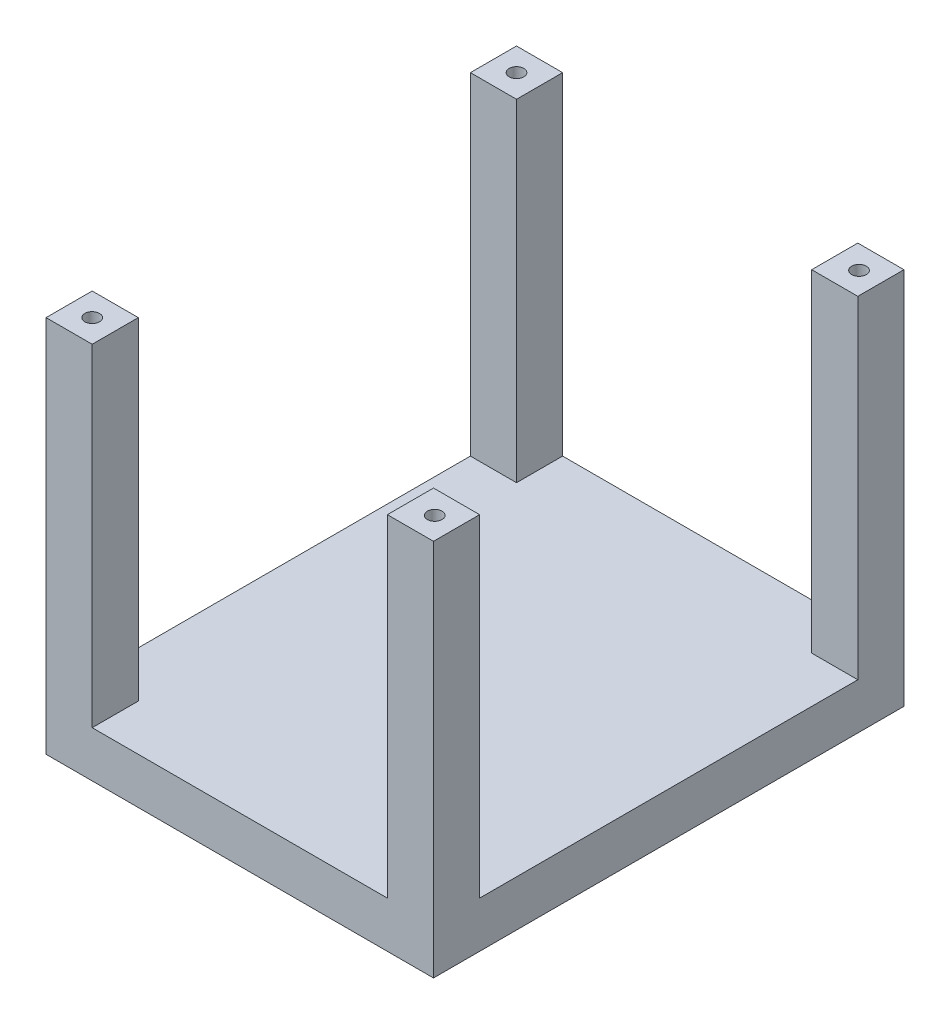
ISO-10303-21;
HEADER;
FILE_DESCRIPTION(('STEP AP214'),'2;1');
FILE_NAME('part.step','',(''),(''),'','','');
FILE_SCHEMA(('AUTOMOTIVE_DESIGN { 1 0 10303 214 1 1 1 1 }'));
ENDSEC;
DATA;
#1=APPLICATION_CONTEXT('core data for automotive mechanical design processes');
#2=APPLICATION_PROTOCOL_DEFINITION('international standard','automotive_design',2000,#1);
#3=PRODUCT_CONTEXT('',#1,'mechanical');
#4=PRODUCT('Part','Part','',(#3));
#5=PRODUCT_RELATED_PRODUCT_CATEGORY('part','',(#4));
#6=PRODUCT_DEFINITION_FORMATION('','',#4);
#7=PRODUCT_DEFINITION_CONTEXT('part definition',#1,'design');
#8=PRODUCT_DEFINITION('design','',#6,#7);
#9=PRODUCT_DEFINITION_SHAPE('','',#8);
#10=(LENGTH_UNIT() NAMED_UNIT(*) SI_UNIT(.MILLI.,.METRE.));
#11=(NAMED_UNIT(*) PLANE_ANGLE_UNIT() SI_UNIT($,.RADIAN.));
#12=(NAMED_UNIT(*) SI_UNIT($,.STERADIAN.) SOLID_ANGLE_UNIT());
#13=UNCERTAINTY_MEASURE_WITH_UNIT(LENGTH_MEASURE(1.E-05),#10,'distance_accuracy_value','');
#14=(GEOMETRIC_REPRESENTATION_CONTEXT(3) GLOBAL_UNCERTAINTY_ASSIGNED_CONTEXT((#13)) GLOBAL_UNIT_ASSIGNED_CONTEXT((#10,
#11,#12)) REPRESENTATION_CONTEXT('',''));
#15=CARTESIAN_POINT('',(0.,0.,0.));
#16=DIRECTION('',(0.,0.,1.));
#17=DIRECTION('',(1.,0.,0.));
#18=AXIS2_PLACEMENT_3D('',#15,#16,#17);
#19=CARTESIAN_POINT('',(0.,5.,0.));
#20=DIRECTION('',(0.,1.,0.));
#21=DIRECTION('',(0.,0.,1.));
#22=AXIS2_PLACEMENT_3D('',#19,#20,#21);
#23=PLANE('',#22);
#24=DIRECTION('',(1.,0.,0.));
#25=VECTOR('',#24,1.);
#26=CARTESIAN_POINT('',(-21.0659404071455,5.,39.3560433183073));
#27=LINE('',#26,#25);
#28=CARTESIAN_POINT('',(-16.0659404071455,5.,39.3560433183074));
#29=VERTEX_POINT('',#28);
#30=CARTESIAN_POINT('',(15.9340595928545,5.,39.3560433183073));
#31=VERTEX_POINT('',#30);
#32=EDGE_CURVE('E258',#29,#31,#27,.T.);
#33=ORIENTED_EDGE('',*,*,#32,.T.);
#34=DIRECTION('',(0.,0.,-1.));
#35=VECTOR('',#34,1.);
#36=CARTESIAN_POINT('',(15.9340595928545,5.,0.));
#37=LINE('',#36,#35);
#38=CARTESIAN_POINT('',(15.9340595928545,5.,34.3560433183073));
#39=VERTEX_POINT('',#38);
#40=EDGE_CURVE('E187',#31,#39,#37,.T.);
#41=ORIENTED_EDGE('',*,*,#40,.T.);
#42=DIRECTION('',(1.,0.,0.));
#43=VECTOR('',#42,1.);
#44=CARTESIAN_POINT('',(0.,5.,34.3560433183073));
#45=LINE('',#44,#43);
#46=CARTESIAN_POINT('',(20.9340595928545,5.,34.3560433183073));
#47=VERTEX_POINT('',#46);
#48=EDGE_CURVE('E174',#39,#47,#45,.T.);
#49=ORIENTED_EDGE('',*,*,#48,.T.);
#50=DIRECTION('',(0.,0.,-1.));
#51=VECTOR('',#50,1.);
#52=CARTESIAN_POINT('',(20.9340595928545,5.,-11.6439566816926));
#53=LINE('',#52,#51);
#54=CARTESIAN_POINT('',(20.9340595928545,5.,-6.64395668169275));
#55=VERTEX_POINT('',#54);
#56=EDGE_CURVE('E263',#47,#55,#53,.T.);
#57=ORIENTED_EDGE('',*,*,#56,.T.);
#58=DIRECTION('',(-1.,0.,0.));
#59=VECTOR('',#58,1.);
#60=CARTESIAN_POINT('',(0.,5.,-6.64395668169274));
#61=LINE('',#60,#59);
#62=CARTESIAN_POINT('',(15.9340595928545,5.,-6.64395668169274));
#63=VERTEX_POINT('',#62);
#64=EDGE_CURVE('E250',#55,#63,#61,.T.);
#65=ORIENTED_EDGE('',*,*,#64,.T.);
#66=DIRECTION('',(0.,0.,-1.));
#67=VECTOR('',#66,1.);
#68=CARTESIAN_POINT('',(15.9340595928545,5.,0.));
#69=LINE('',#68,#67);
#70=CARTESIAN_POINT('',(15.9340595928545,5.,-11.6439566816926));
#71=VERTEX_POINT('',#70);
#72=EDGE_CURVE('E11',#63,#71,#69,.T.);
#73=ORIENTED_EDGE('',*,*,#72,.T.);
#74=DIRECTION('',(-1.,0.,0.));
#75=VECTOR('',#74,1.);
#76=CARTESIAN_POINT('',(-21.0659404071455,5.,-11.6439566816926));
#77=LINE('',#76,#75);
#78=CARTESIAN_POINT('',(-16.0659404071455,5.,-11.6439566816926));
#79=VERTEX_POINT('',#78);
#80=EDGE_CURVE('E266',#71,#79,#77,.T.);
#81=ORIENTED_EDGE('',*,*,#80,.T.);
#82=DIRECTION('',(0.,0.,-1.));
#83=VECTOR('',#82,1.);
#84=CARTESIAN_POINT('',(-16.0659404071455,5.,-11.6439566816926));
#85=LINE('',#84,#83);
#86=CARTESIAN_POINT('',(-16.0659404071455,5.,-6.64395668169265));
#87=VERTEX_POINT('',#86);
#88=EDGE_CURVE('E285',#87,#79,#85,.T.);
#89=ORIENTED_EDGE('',*,*,#88,.F.);
#90=DIRECTION('',(1.,0.,0.));
#91=VECTOR('',#90,1.);
#92=CARTESIAN_POINT('',(-21.0659404071455,5.,-6.64395668169265));
#93=LINE('',#92,#91);
#94=CARTESIAN_POINT('',(-21.0659404071455,5.,-6.64395668169265));
#95=VERTEX_POINT('',#94);
#96=EDGE_CURVE('E289',#95,#87,#93,.T.);
#97=ORIENTED_EDGE('',*,*,#96,.F.);
#98=DIRECTION('',(0.,0.,1.));
#99=VECTOR('',#98,1.);
#100=CARTESIAN_POINT('',(-21.0659404071455,5.,-11.6439566816926));
#101=LINE('',#100,#99);
#102=CARTESIAN_POINT('',(-21.0659404071455,5.,34.3560433183074));
#103=VERTEX_POINT('',#102);
#104=EDGE_CURVE('E254',#95,#103,#101,.T.);
#105=ORIENTED_EDGE('',*,*,#104,.T.);
#106=DIRECTION('',(1.,0.,0.));
#107=VECTOR('',#106,1.);
#108=CARTESIAN_POINT('',(0.,5.,34.3560433183074));
#109=LINE('',#108,#107);
#110=CARTESIAN_POINT('',(-16.0659404071455,5.,34.3560433183074));
#111=VERTEX_POINT('',#110);
#112=EDGE_CURVE('E220',#103,#111,#109,.T.);
#113=ORIENTED_EDGE('',*,*,#112,.T.);
#114=DIRECTION('',(0.,0.,1.));
#115=VECTOR('',#114,1.);
#116=CARTESIAN_POINT('',(-16.0659404071455,5.,0.));
#117=LINE('',#116,#115);
#118=EDGE_CURVE('E216',#111,#29,#117,.T.);
#119=ORIENTED_EDGE('',*,*,#118,.T.);
#120=EDGE_LOOP('',(#33,#41,#49,#57,#65,#73,#81,#89,#97,#105,#113,#119));
#121=FACE_BOUND('',#120,.T.);
#122=ADVANCED_FACE('F45',(#121),#23,.T.);
#123=CARTESIAN_POINT('',(-21.0659404071455,41.,-11.6439566816926));
#124=DIRECTION('',(1.,0.,0.));
#125=DIRECTION('',(0.,0.,-1.));
#126=AXIS2_PLACEMENT_3D('',#123,#124,#125);
#127=PLANE('',#126);
#128=DIRECTION('',(0.,-1.,0.));
#129=VECTOR('',#128,1.);
#130=CARTESIAN_POINT('',(-21.0659404071455,5.,39.3560433183073));
#131=LINE('',#130,#129);
#132=CARTESIAN_POINT('',(-21.0659404071455,41.,39.3560433183073));
#133=VERTEX_POINT('',#132);
#134=CARTESIAN_POINT('',(-21.0659404071455,0.,39.3560433183073));
#135=VERTEX_POINT('',#134);
#136=EDGE_CURVE('E281',#133,#135,#131,.T.);
#137=ORIENTED_EDGE('',*,*,#136,.F.);
#138=DIRECTION('',(0.,0.,1.));
#139=VECTOR('',#138,1.);
#140=CARTESIAN_POINT('',(-21.0659404071455,41.,34.3560433183074));
#141=LINE('',#140,#139);
#142=CARTESIAN_POINT('',(-21.0659404071455,41.,34.3560433183074));
#143=VERTEX_POINT('',#142);
#144=EDGE_CURVE('E212',#143,#133,#141,.T.);
#145=ORIENTED_EDGE('',*,*,#144,.F.);
#146=DIRECTION('',(0.,-1.,0.));
#147=VECTOR('',#146,1.);
#148=CARTESIAN_POINT('',(-21.0659404071455,41.,34.3560433183074));
#149=LINE('',#148,#147);
#150=EDGE_CURVE('E199',#143,#103,#149,.T.);
#151=ORIENTED_EDGE('',*,*,#150,.T.);
#152=ORIENTED_EDGE('',*,*,#104,.F.);
#153=DIRECTION('',(0.,-1.,0.));
#154=VECTOR('',#153,1.);
#155=CARTESIAN_POINT('',(-21.0659404071455,41.,-6.64395668169265));
#156=LINE('',#155,#154);
#157=CARTESIAN_POINT('',(-21.0659404071455,41.,-6.64395668169265));
#158=VERTEX_POINT('',#157);
#159=EDGE_CURVE('E54',#158,#95,#156,.T.);
#160=ORIENTED_EDGE('',*,*,#159,.F.);
#161=DIRECTION('',(0.,0.,1.));
#162=VECTOR('',#161,1.);
#163=CARTESIAN_POINT('',(-21.0659404071455,41.,-11.6439566816926));
#164=LINE('',#163,#162);
#165=CARTESIAN_POINT('',(-21.0659404071455,41.,-11.6439566816926));
#166=VERTEX_POINT('',#165);
#167=EDGE_CURVE('E293',#166,#158,#164,.T.);
#168=ORIENTED_EDGE('',*,*,#167,.F.);
#169=DIRECTION('',(0.,-1.,0.));
#170=VECTOR('',#169,1.);
#171=CARTESIAN_POINT('',(-21.0659404071455,41.,-11.6439566816926));
#172=LINE('',#171,#170);
#173=CARTESIAN_POINT('',(-21.0659404071455,0.,-11.6439566816926));
#174=VERTEX_POINT('',#173);
#175=EDGE_CURVE('E307',#166,#174,#172,.T.);
#176=ORIENTED_EDGE('',*,*,#175,.T.);
#177=DIRECTION('',(0.,0.,1.));
#178=VECTOR('',#177,1.);
#179=CARTESIAN_POINT('',(-21.0659404071455,0.,-11.6439566816926));
#180=LINE('',#179,#178);
#181=EDGE_CURVE('E292',#174,#135,#180,.T.);
#182=ORIENTED_EDGE('',*,*,#181,.T.);
#183=EDGE_LOOP('',(#137,#145,#151,#152,#160,#168,#176,#182));
#184=FACE_BOUND('',#183,.T.);
#185=ADVANCED_FACE('F47',(#184),#127,.F.);
#186=CARTESIAN_POINT('',(-21.0659404071455,41.,-6.64395668169265));
#187=DIRECTION('',(0.,0.,-1.));
#188=DIRECTION('',(-1.,0.,0.));
#189=AXIS2_PLACEMENT_3D('',#186,#187,#188);
#190=PLANE('',#189);
#191=ORIENTED_EDGE('',*,*,#159,.T.);
#192=ORIENTED_EDGE('',*,*,#96,.T.);
#193=DIRECTION('',(0.,-1.,0.));
#194=VECTOR('',#193,1.);
#195=CARTESIAN_POINT('',(-16.0659404071455,41.,-6.64395668169265));
#196=LINE('',#195,#194);
#197=CARTESIAN_POINT('',(-16.0659404071455,41.,-6.64395668169265));
#198=VERTEX_POINT('',#197);
#199=EDGE_CURVE('E319',#198,#87,#196,.T.);
#200=ORIENTED_EDGE('',*,*,#199,.F.);
#201=DIRECTION('',(1.,0.,0.));
#202=VECTOR('',#201,1.);
#203=CARTESIAN_POINT('',(-21.0659404071455,41.,-6.64395668169265));
#204=LINE('',#203,#202);
#205=EDGE_CURVE('E297',#158,#198,#204,.T.);
#206=ORIENTED_EDGE('',*,*,#205,.F.);
#207=EDGE_LOOP('',(#191,#192,#200,#206));
#208=FACE_BOUND('',#207,.T.);
#209=ADVANCED_FACE('F326',(#208),#190,.F.);
#210=CARTESIAN_POINT('',(-16.0659404071455,41.,-11.6439566816926));
#211=DIRECTION('',(-1.,0.,0.));
#212=DIRECTION('',(0.,0.,1.));
#213=AXIS2_PLACEMENT_3D('',#210,#211,#212);
#214=PLANE('',#213);
#215=ORIENTED_EDGE('',*,*,#199,.T.);
#216=ORIENTED_EDGE('',*,*,#88,.T.);
#217=DIRECTION('',(0.,-1.,0.));
#218=VECTOR('',#217,1.);
#219=CARTESIAN_POINT('',(-16.0659404071455,41.,-11.6439566816926));
#220=LINE('',#219,#218);
#221=CARTESIAN_POINT('',(-16.0659404071455,41.,-11.6439566816926));
#222=VERTEX_POINT('',#221);
#223=EDGE_CURVE('E315',#222,#79,#220,.T.);
#224=ORIENTED_EDGE('',*,*,#223,.F.);
#225=DIRECTION('',(0.,0.,-1.));
#226=VECTOR('',#225,1.);
#227=CARTESIAN_POINT('',(-16.0659404071455,41.,-11.6439566816926));
#228=LINE('',#227,#226);
#229=EDGE_CURVE('E301',#198,#222,#228,.T.);
#230=ORIENTED_EDGE('',*,*,#229,.F.);
#231=EDGE_LOOP('',(#215,#216,#224,#230));
#232=FACE_BOUND('',#231,.T.);
#233=ADVANCED_FACE('F444',(#232),#214,.F.);
#234=CARTESIAN_POINT('',(-21.0659404071455,41.,-11.6439566816926));
#235=DIRECTION('',(0.,0.,1.));
#236=DIRECTION('',(1.,0.,0.));
#237=AXIS2_PLACEMENT_3D('',#234,#235,#236);
#238=PLANE('',#237);
#239=DIRECTION('',(-1.,0.,0.));
#240=VECTOR('',#239,1.);
#241=CARTESIAN_POINT('',(-21.0659404071455,0.,-11.6439566816926));
#242=LINE('',#241,#240);
#243=CARTESIAN_POINT('',(20.9340595928545,0.,-11.6439566816926));
#244=VERTEX_POINT('',#243);
#245=EDGE_CURVE('E298',#244,#174,#242,.T.);
#246=ORIENTED_EDGE('',*,*,#245,.T.);
#247=ORIENTED_EDGE('',*,*,#175,.F.);
#248=DIRECTION('',(-1.,0.,0.));
#249=VECTOR('',#248,1.);
#250=CARTESIAN_POINT('',(-21.0659404071455,41.,-11.6439566816926));
#251=LINE('',#250,#249);
#252=EDGE_CURVE('E304',#222,#166,#251,.T.);
#253=ORIENTED_EDGE('',*,*,#252,.F.);
#254=ORIENTED_EDGE('',*,*,#223,.T.);
#255=ORIENTED_EDGE('',*,*,#80,.F.);
#256=DIRECTION('',(0.,-1.,0.));
#257=VECTOR('',#256,1.);
#258=CARTESIAN_POINT('',(15.9340595928545,41.,-11.6439566816926));
#259=LINE('',#258,#257);
#260=CARTESIAN_POINT('',(15.9340595928545,41.,-11.6439566816926));
#261=VERTEX_POINT('',#260);
#262=EDGE_CURVE('E232',#261,#71,#259,.T.);
#263=ORIENTED_EDGE('',*,*,#262,.F.);
#264=DIRECTION('',(-1.,0.,0.));
#265=VECTOR('',#264,1.);
#266=CARTESIAN_POINT('',(15.9340595928545,41.,-11.6439566816926));
#267=LINE('',#266,#265);
#268=CARTESIAN_POINT('',(20.9340595928545,41.,-11.6439566816926));
#269=VERTEX_POINT('',#268);
#270=EDGE_CURVE('E236',#269,#261,#267,.T.);
#271=ORIENTED_EDGE('',*,*,#270,.F.);
#272=DIRECTION('',(0.,-1.,0.));
#273=VECTOR('',#272,1.);
#274=CARTESIAN_POINT('',(20.9340595928545,5.,-11.6439566816926));
#275=LINE('',#274,#273);
#276=EDGE_CURVE('E269',#269,#244,#275,.T.);
#277=ORIENTED_EDGE('',*,*,#276,.T.);
#278=EDGE_LOOP('',(#246,#247,#253,#254,#255,#263,#271,#277));
#279=FACE_BOUND('',#278,.T.);
#280=ADVANCED_FACE('F406',(#279),#238,.F.);
#281=CARTESIAN_POINT('',(0.,41.,0.));
#282=DIRECTION('',(0.,1.,0.));
#283=DIRECTION('',(0.,0.,1.));
#284=AXIS2_PLACEMENT_3D('',#281,#282,#283);
#285=PLANE('',#284);
#286=CARTESIAN_POINT('',(-18.5659404071455,41.,-9.14395668169264));
#287=DIRECTION('',(0.,1.,0.));
#288=DIRECTION('',(0.,0.,1.));
#289=AXIS2_PLACEMENT_3D('',#286,#287,#288);
#290=CIRCLE('',#289,0.793749999999999);
#291=CARTESIAN_POINT('',(-18.5659404071455,41.,-8.35020668169265));
#292=VERTEX_POINT('',#291);
#293=EDGE_CURVE('E350',#292,#292,#290,.T.);
#294=ORIENTED_EDGE('',*,*,#293,.F.);
#295=EDGE_LOOP('',(#294));
#296=FACE_BOUND('',#295,.T.);
#297=ORIENTED_EDGE('',*,*,#167,.T.);
#298=ORIENTED_EDGE('',*,*,#205,.T.);
#299=ORIENTED_EDGE('',*,*,#229,.T.);
#300=ORIENTED_EDGE('',*,*,#252,.T.);
#301=EDGE_LOOP('',(#297,#298,#299,#300));
#302=FACE_BOUND('',#301,.T.);
#303=ADVANCED_FACE('F388',(#296,#302),#285,.T.);
#304=CARTESIAN_POINT('',(0.,0.,0.));
#305=DIRECTION('',(0.,1.,0.));
#306=DIRECTION('',(0.,0.,1.));
#307=AXIS2_PLACEMENT_3D('',#304,#305,#306);
#308=PLANE('',#307);
#309=CARTESIAN_POINT('',(18.5659404071455,0.,-9.14395668169264));
#310=DIRECTION('',(0.,-1.,0.));
#311=DIRECTION('',(0.,0.,1.));
#312=AXIS2_PLACEMENT_3D('',#309,#310,#311);
#313=CIRCLE('',#312,0.793749999999999);
#314=CARTESIAN_POINT('',(18.5659404071455,0.,-8.35020668169265));
#315=VERTEX_POINT('',#314);
#316=EDGE_CURVE('E359',#315,#315,#313,.T.);
#317=ORIENTED_EDGE('',*,*,#316,.F.);
#318=EDGE_LOOP('',(#317));
#319=FACE_BOUND('',#318,.T.);
#320=CARTESIAN_POINT('',(18.5659404071455,0.,36.8560433183073));
#321=DIRECTION('',(0.,-1.,0.));
#322=DIRECTION('',(0.,0.,1.));
#323=AXIS2_PLACEMENT_3D('',#320,#321,#322);
#324=CIRCLE('',#323,0.793749999999999);
#325=CARTESIAN_POINT('',(18.5659404071455,0.,37.6497933183074));
#326=VERTEX_POINT('',#325);
#327=EDGE_CURVE('E370',#326,#326,#324,.T.);
#328=ORIENTED_EDGE('',*,*,#327,.F.);
#329=EDGE_LOOP('',(#328));
#330=FACE_BOUND('',#329,.T.);
#331=CARTESIAN_POINT('',(-18.5659404071455,0.,-9.14395668169264));
#332=DIRECTION('',(0.,1.,0.));
#333=DIRECTION('',(0.,0.,1.));
#334=AXIS2_PLACEMENT_3D('',#331,#332,#333);
#335=CIRCLE('',#334,0.793749999999999);
#336=CARTESIAN_POINT('',(-18.5659404071455,0.,-8.35020668169265));
#337=VERTEX_POINT('',#336);
#338=EDGE_CURVE('E344',#337,#337,#335,.T.);
#339=ORIENTED_EDGE('',*,*,#338,.T.);
#340=EDGE_LOOP('',(#339));
#341=FACE_BOUND('',#340,.T.);
#342=CARTESIAN_POINT('',(-18.5659404071455,0.,36.8560433183073));
#343=DIRECTION('',(0.,1.,0.));
#344=DIRECTION('',(0.,0.,1.));
#345=AXIS2_PLACEMENT_3D('',#342,#343,#344);
#346=CIRCLE('',#345,0.793749999999999);
#347=CARTESIAN_POINT('',(-18.5659404071455,0.,37.6497933183074));
#348=VERTEX_POINT('',#347);
#349=EDGE_CURVE('E353',#348,#348,#346,.T.);
#350=ORIENTED_EDGE('',*,*,#349,.T.);
#351=EDGE_LOOP('',(#350));
#352=FACE_BOUND('',#351,.T.);
#353=DIRECTION('',(0.,0.,-1.));
#354=VECTOR('',#353,1.);
#355=CARTESIAN_POINT('',(20.9340595928545,0.,-11.6439566816926));
#356=LINE('',#355,#354);
#357=CARTESIAN_POINT('',(20.9340595928545,0.,39.3560433183073));
#358=VERTEX_POINT('',#357);
#359=EDGE_CURVE('E259',#358,#244,#356,.T.);
#360=ORIENTED_EDGE('',*,*,#359,.F.);
#361=DIRECTION('',(1.,0.,0.));
#362=VECTOR('',#361,1.);
#363=CARTESIAN_POINT('',(-21.0659404071455,0.,39.3560433183073));
#364=LINE('',#363,#362);
#365=EDGE_CURVE('E253',#135,#358,#364,.T.);
#366=ORIENTED_EDGE('',*,*,#365,.F.);
#367=ORIENTED_EDGE('',*,*,#181,.F.);
#368=ORIENTED_EDGE('',*,*,#245,.F.);
#369=EDGE_LOOP('',(#360,#366,#367,#368));
#370=FACE_BOUND('',#369,.T.);
#371=ADVANCED_FACE('F385',(#319,#330,#341,#352,#370),#308,.F.);
#372=CARTESIAN_POINT('',(-21.0659404071455,5.,39.3560433183073));
#373=DIRECTION('',(0.,0.,-1.));
#374=DIRECTION('',(-1.,0.,0.));
#375=AXIS2_PLACEMENT_3D('',#372,#373,#374);
#376=PLANE('',#375);
#377=DIRECTION('',(0.,-1.,0.));
#378=VECTOR('',#377,1.);
#379=CARTESIAN_POINT('',(20.9340595928545,5.,39.3560433183073));
#380=LINE('',#379,#378);
#381=CARTESIAN_POINT('',(20.9340595928545,41.,39.3560433183073));
#382=VERTEX_POINT('',#381);
#383=EDGE_CURVE('E277',#382,#358,#380,.T.);
#384=ORIENTED_EDGE('',*,*,#383,.F.);
#385=DIRECTION('',(1.,0.,0.));
#386=VECTOR('',#385,1.);
#387=CARTESIAN_POINT('',(15.9340595928545,41.,39.3560433183073));
#388=LINE('',#387,#386);
#389=CARTESIAN_POINT('',(15.9340595928545,41.,39.3560433183073));
#390=VERTEX_POINT('',#389);
#391=EDGE_CURVE('E183',#390,#382,#388,.T.);
#392=ORIENTED_EDGE('',*,*,#391,.F.);
#393=DIRECTION('',(0.,-1.,0.));
#394=VECTOR('',#393,1.);
#395=CARTESIAN_POINT('',(15.9340595928545,41.,39.3560433183073));
#396=LINE('',#395,#394);
#397=EDGE_CURVE('E181',#390,#31,#396,.T.);
#398=ORIENTED_EDGE('',*,*,#397,.T.);
#399=ORIENTED_EDGE('',*,*,#32,.F.);
#400=DIRECTION('',(0.,-1.,0.));
#401=VECTOR('',#400,1.);
#402=CARTESIAN_POINT('',(-16.0659404071455,41.,39.3560433183074));
#403=LINE('',#402,#401);
#404=CARTESIAN_POINT('',(-16.0659404071455,41.,39.3560433183074));
#405=VERTEX_POINT('',#404);
#406=EDGE_CURVE('E194',#405,#29,#403,.T.);
#407=ORIENTED_EDGE('',*,*,#406,.F.);
#408=DIRECTION('',(1.,0.,0.));
#409=VECTOR('',#408,1.);
#410=CARTESIAN_POINT('',(-21.0659404071455,41.,39.3560433183073));
#411=LINE('',#410,#409);
#412=EDGE_CURVE('E209',#133,#405,#411,.T.);
#413=ORIENTED_EDGE('',*,*,#412,.F.);
#414=ORIENTED_EDGE('',*,*,#136,.T.);
#415=ORIENTED_EDGE('',*,*,#365,.T.);
#416=EDGE_LOOP('',(#384,#392,#398,#399,#407,#413,#414,#415));
#417=FACE_BOUND('',#416,.T.);
#418=ADVANCED_FACE('F340',(#417),#376,.F.);
#419=CARTESIAN_POINT('',(20.9340595928545,5.,-11.6439566816926));
#420=DIRECTION('',(-1.,0.,0.));
#421=DIRECTION('',(0.,0.,1.));
#422=AXIS2_PLACEMENT_3D('',#419,#420,#421);
#423=PLANE('',#422);
#424=ORIENTED_EDGE('',*,*,#359,.T.);
#425=ORIENTED_EDGE('',*,*,#276,.F.);
#426=DIRECTION('',(0.,0.,-1.));
#427=VECTOR('',#426,1.);
#428=CARTESIAN_POINT('',(20.9340595928545,41.,-11.6439566816926));
#429=LINE('',#428,#427);
#430=CARTESIAN_POINT('',(20.9340595928545,41.,-6.64395668169275));
#431=VERTEX_POINT('',#430);
#432=EDGE_CURVE('E239',#431,#269,#429,.T.);
#433=ORIENTED_EDGE('',*,*,#432,.F.);
#434=DIRECTION('',(0.,-1.,0.));
#435=VECTOR('',#434,1.);
#436=CARTESIAN_POINT('',(20.9340595928545,41.,-6.64395668169275));
#437=LINE('',#436,#435);
#438=EDGE_CURVE('E228',#431,#55,#437,.T.);
#439=ORIENTED_EDGE('',*,*,#438,.T.);
#440=ORIENTED_EDGE('',*,*,#56,.F.);
#441=DIRECTION('',(0.,-1.,0.));
#442=VECTOR('',#441,1.);
#443=CARTESIAN_POINT('',(20.9340595928545,41.,34.3560433183073));
#444=LINE('',#443,#442);
#445=CARTESIAN_POINT('',(20.9340595928545,41.,34.3560433183073));
#446=VERTEX_POINT('',#445);
#447=EDGE_CURVE('E61',#446,#47,#444,.T.);
#448=ORIENTED_EDGE('',*,*,#447,.F.);
#449=DIRECTION('',(0.,0.,-1.));
#450=VECTOR('',#449,1.);
#451=CARTESIAN_POINT('',(20.9340595928545,41.,34.3560433183073));
#452=LINE('',#451,#450);
#453=EDGE_CURVE('E168',#382,#446,#452,.T.);
#454=ORIENTED_EDGE('',*,*,#453,.F.);
#455=ORIENTED_EDGE('',*,*,#383,.T.);
#456=EDGE_LOOP('',(#424,#425,#433,#439,#440,#448,#454,#455));
#457=FACE_BOUND('',#456,.T.);
#458=ADVANCED_FACE('F401',(#457),#423,.F.);
#459=CARTESIAN_POINT('',(15.9340595928545,41.,-11.6439566816926));
#460=DIRECTION('',(1.,0.,0.));
#461=DIRECTION('',(0.,0.,-1.));
#462=AXIS2_PLACEMENT_3D('',#459,#460,#461);
#463=PLANE('',#462);
#464=ORIENTED_EDGE('',*,*,#72,.F.);
#465=DIRECTION('',(0.,-1.,0.));
#466=VECTOR('',#465,1.);
#467=CARTESIAN_POINT('',(15.9340595928545,41.,-6.64395668169274));
#468=LINE('',#467,#466);
#469=CARTESIAN_POINT('',(15.9340595928545,41.,-6.64395668169274));
#470=VERTEX_POINT('',#469);
#471=EDGE_CURVE('E224',#470,#63,#468,.T.);
#472=ORIENTED_EDGE('',*,*,#471,.F.);
#473=DIRECTION('',(0.,0.,1.));
#474=VECTOR('',#473,1.);
#475=CARTESIAN_POINT('',(15.9340595928545,41.,-11.6439566816926));
#476=LINE('',#475,#474);
#477=EDGE_CURVE('E246',#261,#470,#476,.T.);
#478=ORIENTED_EDGE('',*,*,#477,.F.);
#479=ORIENTED_EDGE('',*,*,#262,.T.);
#480=EDGE_LOOP('',(#464,#472,#478,#479));
#481=FACE_BOUND('',#480,.T.);
#482=ADVANCED_FACE('F420',(#481),#463,.F.);
#483=CARTESIAN_POINT('',(15.9340595928545,41.,-6.64395668169274));
#484=DIRECTION('',(0.,0.,-1.));
#485=DIRECTION('',(-1.,0.,0.));
#486=AXIS2_PLACEMENT_3D('',#483,#484,#485);
#487=PLANE('',#486);
#488=ORIENTED_EDGE('',*,*,#64,.F.);
#489=ORIENTED_EDGE('',*,*,#438,.F.);
#490=DIRECTION('',(1.,0.,0.));
#491=VECTOR('',#490,1.);
#492=CARTESIAN_POINT('',(15.9340595928545,41.,-6.64395668169274));
#493=LINE('',#492,#491);
#494=EDGE_CURVE('E243',#470,#431,#493,.T.);
#495=ORIENTED_EDGE('',*,*,#494,.F.);
#496=ORIENTED_EDGE('',*,*,#471,.T.);
#497=EDGE_LOOP('',(#488,#489,#495,#496));
#498=FACE_BOUND('',#497,.T.);
#499=ADVANCED_FACE('F417',(#498),#487,.F.);
#500=CARTESIAN_POINT('',(0.,41.,0.));
#501=DIRECTION('',(0.,1.,0.));
#502=DIRECTION('',(0.,0.,1.));
#503=AXIS2_PLACEMENT_3D('',#500,#501,#502);
#504=PLANE('',#503);
#505=CARTESIAN_POINT('',(18.5659404071455,41.,-9.14395668169264));
#506=DIRECTION('',(0.,-1.,0.));
#507=DIRECTION('',(0.,0.,1.));
#508=AXIS2_PLACEMENT_3D('',#505,#506,#507);
#509=CIRCLE('',#508,0.793749999999999);
#510=CARTESIAN_POINT('',(18.5659404071455,41.,-8.35020668169265));
#511=VERTEX_POINT('',#510);
#512=EDGE_CURVE('E374',#511,#511,#509,.T.);
#513=ORIENTED_EDGE('',*,*,#512,.T.);
#514=EDGE_LOOP('',(#513));
#515=FACE_BOUND('',#514,.T.);
#516=ORIENTED_EDGE('',*,*,#477,.T.);
#517=ORIENTED_EDGE('',*,*,#494,.T.);
#518=ORIENTED_EDGE('',*,*,#432,.T.);
#519=ORIENTED_EDGE('',*,*,#270,.T.);
#520=EDGE_LOOP('',(#516,#517,#518,#519));
#521=FACE_BOUND('',#520,.T.);
#522=ADVANCED_FACE('F411',(#515,#521),#504,.T.);
#523=CARTESIAN_POINT('',(-16.0659404071455,41.,34.3560433183074));
#524=DIRECTION('',(-1.,0.,0.));
#525=DIRECTION('',(0.,0.,1.));
#526=AXIS2_PLACEMENT_3D('',#523,#524,#525);
#527=PLANE('',#526);
#528=ORIENTED_EDGE('',*,*,#118,.F.);
#529=DIRECTION('',(0.,-1.,0.));
#530=VECTOR('',#529,1.);
#531=CARTESIAN_POINT('',(-16.0659404071455,41.,34.3560433183074));
#532=LINE('',#531,#530);
#533=CARTESIAN_POINT('',(-16.0659404071455,41.,34.3560433183074));
#534=VERTEX_POINT('',#533);
#535=EDGE_CURVE('E69',#534,#111,#532,.T.);
#536=ORIENTED_EDGE('',*,*,#535,.F.);
#537=DIRECTION('',(0.,0.,-1.));
#538=VECTOR('',#537,1.);
#539=CARTESIAN_POINT('',(-16.0659404071455,41.,34.3560433183074));
#540=LINE('',#539,#538);
#541=EDGE_CURVE('E206',#405,#534,#540,.T.);
#542=ORIENTED_EDGE('',*,*,#541,.F.);
#543=ORIENTED_EDGE('',*,*,#406,.T.);
#544=EDGE_LOOP('',(#528,#536,#542,#543));
#545=FACE_BOUND('',#544,.T.);
#546=ADVANCED_FACE('F531',(#545),#527,.F.);
#547=CARTESIAN_POINT('',(-21.0659404071455,41.,34.3560433183074));
#548=DIRECTION('',(0.,0.,1.));
#549=DIRECTION('',(1.,0.,0.));
#550=AXIS2_PLACEMENT_3D('',#547,#548,#549);
#551=PLANE('',#550);
#552=ORIENTED_EDGE('',*,*,#112,.F.);
#553=ORIENTED_EDGE('',*,*,#150,.F.);
#554=DIRECTION('',(-1.,0.,0.));
#555=VECTOR('',#554,1.);
#556=CARTESIAN_POINT('',(-21.0659404071455,41.,34.3560433183074));
#557=LINE('',#556,#555);
#558=EDGE_CURVE('E203',#534,#143,#557,.T.);
#559=ORIENTED_EDGE('',*,*,#558,.F.);
#560=ORIENTED_EDGE('',*,*,#535,.T.);
#561=EDGE_LOOP('',(#552,#553,#559,#560));
#562=FACE_BOUND('',#561,.T.);
#563=ADVANCED_FACE('F335',(#562),#551,.F.);
#564=CARTESIAN_POINT('',(0.,41.,0.));
#565=DIRECTION('',(0.,1.,0.));
#566=DIRECTION('',(0.,0.,1.));
#567=AXIS2_PLACEMENT_3D('',#564,#565,#566);
#568=PLANE('',#567);
#569=CARTESIAN_POINT('',(-18.5659404071455,41.,36.8560433183073));
#570=DIRECTION('',(0.,1.,0.));
#571=DIRECTION('',(0.,0.,1.));
#572=AXIS2_PLACEMENT_3D('',#569,#570,#571);
#573=CIRCLE('',#572,0.793749999999999);
#574=CARTESIAN_POINT('',(-18.5659404071455,41.,37.6497933183074));
#575=VERTEX_POINT('',#574);
#576=EDGE_CURVE('E358',#575,#575,#573,.T.);
#577=ORIENTED_EDGE('',*,*,#576,.F.);
#578=EDGE_LOOP('',(#577));
#579=FACE_BOUND('',#578,.T.);
#580=ORIENTED_EDGE('',*,*,#144,.T.);
#581=ORIENTED_EDGE('',*,*,#412,.T.);
#582=ORIENTED_EDGE('',*,*,#541,.T.);
#583=ORIENTED_EDGE('',*,*,#558,.T.);
#584=EDGE_LOOP('',(#580,#581,#582,#583));
#585=FACE_BOUND('',#584,.T.);
#586=ADVANCED_FACE('F526',(#579,#585),#568,.T.);
#587=CARTESIAN_POINT('',(15.9340595928545,41.,34.3560433183073));
#588=DIRECTION('',(1.,0.,0.));
#589=DIRECTION('',(0.,0.,-1.));
#590=AXIS2_PLACEMENT_3D('',#587,#588,#589);
#591=PLANE('',#590);
#592=ORIENTED_EDGE('',*,*,#40,.F.);
#593=ORIENTED_EDGE('',*,*,#397,.F.);
#594=DIRECTION('',(0.,0.,1.));
#595=VECTOR('',#594,1.);
#596=CARTESIAN_POINT('',(15.9340595928545,41.,34.3560433183073));
#597=LINE('',#596,#595);
#598=CARTESIAN_POINT('',(15.9340595928545,41.,34.3560433183073));
#599=VERTEX_POINT('',#598);
#600=EDGE_CURVE('E165',#599,#390,#597,.T.);
#601=ORIENTED_EDGE('',*,*,#600,.F.);
#602=DIRECTION('',(0.,-1.,0.));
#603=VECTOR('',#602,1.);
#604=CARTESIAN_POINT('',(15.9340595928545,41.,34.3560433183073));
#605=LINE('',#604,#603);
#606=EDGE_CURVE('E170',#599,#39,#605,.T.);
#607=ORIENTED_EDGE('',*,*,#606,.T.);
#608=EDGE_LOOP('',(#592,#593,#601,#607));
#609=FACE_BOUND('',#608,.T.);
#610=ADVANCED_FACE('F179',(#609),#591,.F.);
#611=CARTESIAN_POINT('',(15.9340595928545,41.,34.3560433183073));
#612=DIRECTION('',(0.,0.,1.));
#613=DIRECTION('',(1.,0.,0.));
#614=AXIS2_PLACEMENT_3D('',#611,#612,#613);
#615=PLANE('',#614);
#616=ORIENTED_EDGE('',*,*,#48,.F.);
#617=ORIENTED_EDGE('',*,*,#606,.F.);
#618=DIRECTION('',(-1.,0.,0.));
#619=VECTOR('',#618,1.);
#620=CARTESIAN_POINT('',(15.9340595928545,41.,34.3560433183073));
#621=LINE('',#620,#619);
#622=EDGE_CURVE('E160',#446,#599,#621,.T.);
#623=ORIENTED_EDGE('',*,*,#622,.F.);
#624=ORIENTED_EDGE('',*,*,#447,.T.);
#625=EDGE_LOOP('',(#616,#617,#623,#624));
#626=FACE_BOUND('',#625,.T.);
#627=ADVANCED_FACE('F173',(#626),#615,.F.);
#628=CARTESIAN_POINT('',(0.,41.,0.));
#629=DIRECTION('',(0.,1.,0.));
#630=DIRECTION('',(0.,0.,1.));
#631=AXIS2_PLACEMENT_3D('',#628,#629,#630);
#632=PLANE('',#631);
#633=CARTESIAN_POINT('',(18.5659404071455,41.,36.8560433183073));
#634=DIRECTION('',(0.,-1.,0.));
#635=DIRECTION('',(0.,0.,1.));
#636=AXIS2_PLACEMENT_3D('',#633,#634,#635);
#637=CIRCLE('',#636,0.793749999999999);
#638=CARTESIAN_POINT('',(18.5659404071455,41.,37.6497933183074));
#639=VERTEX_POINT('',#638);
#640=EDGE_CURVE('E366',#639,#639,#637,.T.);
#641=ORIENTED_EDGE('',*,*,#640,.T.);
#642=EDGE_LOOP('',(#641));
#643=FACE_BOUND('',#642,.T.);
#644=ORIENTED_EDGE('',*,*,#600,.T.);
#645=ORIENTED_EDGE('',*,*,#391,.T.);
#646=ORIENTED_EDGE('',*,*,#453,.T.);
#647=ORIENTED_EDGE('',*,*,#622,.T.);
#648=EDGE_LOOP('',(#644,#645,#646,#647));
#649=FACE_BOUND('',#648,.T.);
#650=ADVANCED_FACE('F162',(#643,#649),#632,.T.);
#651=CARTESIAN_POINT('',(-18.5659404071455,0.,36.8560433183073));
#652=DIRECTION('',(0.,1.,0.));
#653=DIRECTION('',(0.,0.,1.));
#654=AXIS2_PLACEMENT_3D('',#651,#652,#653);
#655=CYLINDRICAL_SURFACE('',#654,0.793749999999999);
#656=ORIENTED_EDGE('',*,*,#349,.F.);
#657=EDGE_LOOP('',(#656));
#658=FACE_BOUND('',#657,.T.);
#659=ORIENTED_EDGE('',*,*,#576,.T.);
#660=EDGE_LOOP('',(#659));
#661=FACE_BOUND('',#660,.T.);
#662=ADVANCED_FACE('F483',(#658,#661),#655,.F.);
#663=CARTESIAN_POINT('',(-18.5659404071455,0.,-9.14395668169264));
#664=DIRECTION('',(0.,1.,0.));
#665=DIRECTION('',(0.,0.,1.));
#666=AXIS2_PLACEMENT_3D('',#663,#664,#665);
#667=CYLINDRICAL_SURFACE('',#666,0.793749999999999);
#668=ORIENTED_EDGE('',*,*,#338,.F.);
#669=EDGE_LOOP('',(#668));
#670=FACE_BOUND('',#669,.T.);
#671=ORIENTED_EDGE('',*,*,#293,.T.);
#672=EDGE_LOOP('',(#671));
#673=FACE_BOUND('',#672,.T.);
#674=ADVANCED_FACE('F489',(#670,#673),#667,.F.);
#675=CARTESIAN_POINT('',(18.5659404071455,0.,36.8560433183073));
#676=DIRECTION('',(0.,1.,0.));
#677=DIRECTION('',(0.,0.,1.));
#678=AXIS2_PLACEMENT_3D('',#675,#676,#677);
#679=CYLINDRICAL_SURFACE('',#678,0.793749999999999);
#680=ORIENTED_EDGE('',*,*,#327,.T.);
#681=EDGE_LOOP('',(#680));
#682=FACE_BOUND('',#681,.T.);
#683=ORIENTED_EDGE('',*,*,#640,.F.);
#684=EDGE_LOOP('',(#683));
#685=FACE_BOUND('',#684,.T.);
#686=ADVANCED_FACE('F501',(#682,#685),#679,.F.);
#687=CARTESIAN_POINT('',(18.5659404071455,0.,-9.14395668169264));
#688=DIRECTION('',(0.,1.,0.));
#689=DIRECTION('',(0.,0.,1.));
#690=AXIS2_PLACEMENT_3D('',#687,#688,#689);
#691=CYLINDRICAL_SURFACE('',#690,0.793749999999999);
#692=ORIENTED_EDGE('',*,*,#316,.T.);
#693=EDGE_LOOP('',(#692));
#694=FACE_BOUND('',#693,.T.);
#695=ORIENTED_EDGE('',*,*,#512,.F.);
#696=EDGE_LOOP('',(#695));
#697=FACE_BOUND('',#696,.T.);
#698=ADVANCED_FACE('F382',(#694,#697),#691,.F.);
#699=CLOSED_SHELL('',(#122,#185,#209,#233,#280,#303,#371,#418,#458,#482,#499,#522,#546,#563,
#586,#610,#627,#650,#662,#674,#686,#698));
#700=MANIFOLD_SOLID_BREP('B2',#699);
#701=ADVANCED_BREP_SHAPE_REPRESENTATION('',(#18,#700),#14);
#702=SHAPE_DEFINITION_REPRESENTATION(#9,#701);
ENDSEC;
END-ISO-10303-21;
